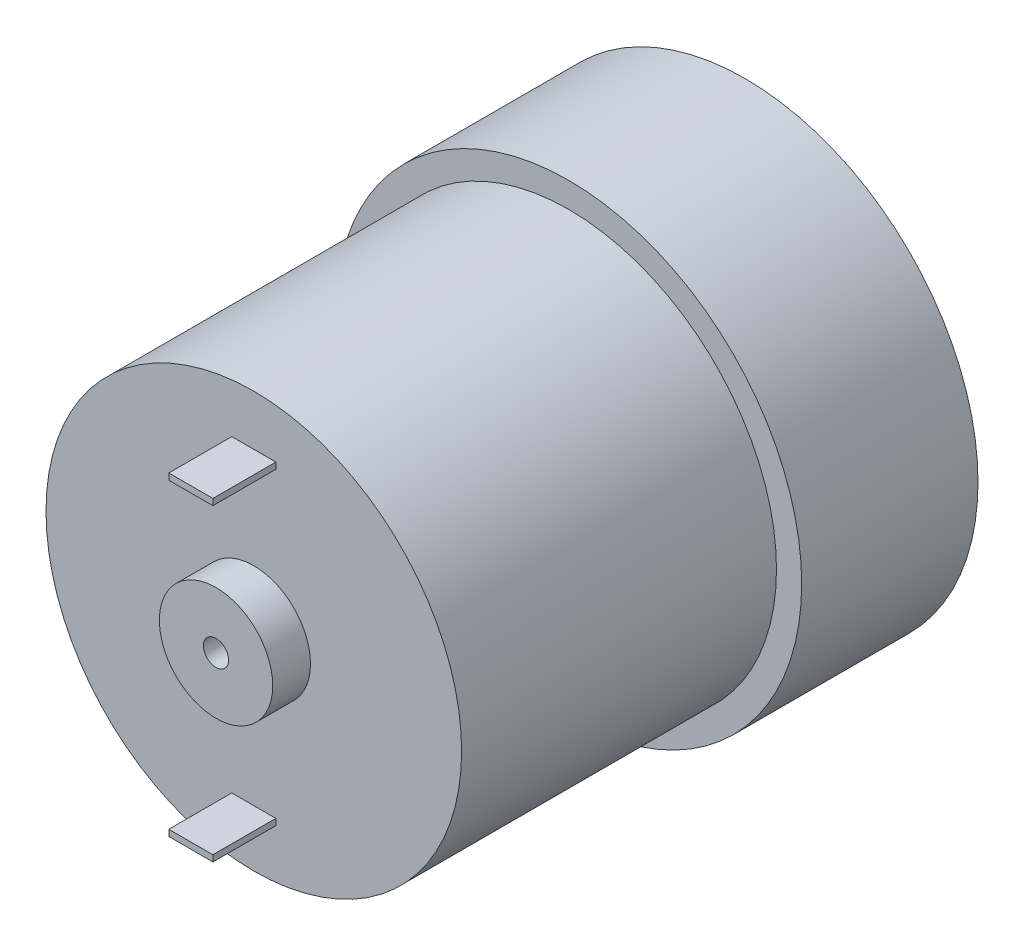
ISO-10303-21;
HEADER;
FILE_DESCRIPTION(('STEP AP214'),'2;1');
FILE_NAME('part.step','',(''),(''),'','','');
FILE_SCHEMA(('AUTOMOTIVE_DESIGN { 1 0 10303 214 1 1 1 1 }'));
ENDSEC;
DATA;
#1=APPLICATION_CONTEXT('core data for automotive mechanical design processes');
#2=APPLICATION_PROTOCOL_DEFINITION('international standard','automotive_design',2000,#1);
#3=PRODUCT_CONTEXT('',#1,'mechanical');
#4=PRODUCT('Part','Part','',(#3));
#5=PRODUCT_RELATED_PRODUCT_CATEGORY('part','',(#4));
#6=PRODUCT_DEFINITION_FORMATION('','',#4);
#7=PRODUCT_DEFINITION_CONTEXT('part definition',#1,'design');
#8=PRODUCT_DEFINITION('design','',#6,#7);
#9=PRODUCT_DEFINITION_SHAPE('','',#8);
#10=(LENGTH_UNIT() NAMED_UNIT(*) SI_UNIT(.MILLI.,.METRE.));
#11=(NAMED_UNIT(*) PLANE_ANGLE_UNIT() SI_UNIT($,.RADIAN.));
#12=(NAMED_UNIT(*) SI_UNIT($,.STERADIAN.) SOLID_ANGLE_UNIT());
#13=UNCERTAINTY_MEASURE_WITH_UNIT(LENGTH_MEASURE(1.E-05),#10,'distance_accuracy_value','');
#14=(GEOMETRIC_REPRESENTATION_CONTEXT(3) GLOBAL_UNCERTAINTY_ASSIGNED_CONTEXT((#13)) GLOBAL_UNIT_ASSIGNED_CONTEXT((#10,
#11,#12)) REPRESENTATION_CONTEXT('',''));
#15=CARTESIAN_POINT('',(0.,0.,0.));
#16=DIRECTION('',(0.,0.,1.));
#17=DIRECTION('',(1.,0.,0.));
#18=AXIS2_PLACEMENT_3D('',#15,#16,#17);
#19=CARTESIAN_POINT('',(0.,0.,39.));
#20=DIRECTION('',(0.,0.,1.));
#21=DIRECTION('',(1.,0.,0.));
#22=AXIS2_PLACEMENT_3D('',#19,#20,#21);
#23=PLANE('',#22);
#24=CARTESIAN_POINT('',(0.,0.,39.));
#25=DIRECTION('',(0.,0.,1.));
#26=DIRECTION('',(1.,0.,0.));
#27=AXIS2_PLACEMENT_3D('',#24,#25,#26);
#28=CIRCLE('',#27,4.5);
#29=CARTESIAN_POINT('',(4.5,0.,39.));
#30=VERTEX_POINT('',#29);
#31=EDGE_CURVE('E247',#30,#30,#28,.T.);
#32=ORIENTED_EDGE('',*,*,#31,.F.);
#33=EDGE_LOOP('',(#32));
#34=FACE_BOUND('',#33,.T.);
#35=CARTESIAN_POINT('',(0.,0.,39.));
#36=DIRECTION('',(0.,0.,1.));
#37=DIRECTION('',(1.,0.,0.));
#38=AXIS2_PLACEMENT_3D('',#35,#36,#37);
#39=CIRCLE('',#38,16.5);
#40=CARTESIAN_POINT('',(16.5,0.,39.));
#41=VERTEX_POINT('',#40);
#42=EDGE_CURVE('E235',#41,#41,#39,.T.);
#43=ORIENTED_EDGE('',*,*,#42,.T.);
#44=EDGE_LOOP('',(#43));
#45=FACE_BOUND('',#44,.T.);
#46=DIRECTION('',(1.,0.,0.));
#47=VECTOR('',#46,1.);
#48=CARTESIAN_POINT('',(1.74999999999997,12.,39.));
#49=LINE('',#48,#47);
#50=CARTESIAN_POINT('',(-1.75000000000003,12.,39.));
#51=VERTEX_POINT('',#50);
#52=CARTESIAN_POINT('',(1.74999999999997,12.,39.));
#53=VERTEX_POINT('',#52);
#54=EDGE_CURVE('E212',#51,#53,#49,.T.);
#55=ORIENTED_EDGE('',*,*,#54,.F.);
#56=DIRECTION('',(0.,-1.,0.));
#57=VECTOR('',#56,1.);
#58=CARTESIAN_POINT('',(-1.75000000000003,12.,39.));
#59=LINE('',#58,#57);
#60=CARTESIAN_POINT('',(-1.75,12.5,39.));
#61=VERTEX_POINT('',#60);
#62=EDGE_CURVE('E198',#61,#51,#59,.T.);
#63=ORIENTED_EDGE('',*,*,#62,.F.);
#64=DIRECTION('',(-1.,0.,0.));
#65=VECTOR('',#64,1.);
#66=CARTESIAN_POINT('',(1.75,12.5,39.));
#67=LINE('',#66,#65);
#68=CARTESIAN_POINT('',(1.75,12.5,39.));
#69=VERTEX_POINT('',#68);
#70=EDGE_CURVE('E203',#69,#61,#67,.T.);
#71=ORIENTED_EDGE('',*,*,#70,.F.);
#72=DIRECTION('',(0.,1.,0.));
#73=VECTOR('',#72,1.);
#74=CARTESIAN_POINT('',(1.74999999999997,12.,39.));
#75=LINE('',#74,#73);
#76=EDGE_CURVE('E214',#53,#69,#75,.T.);
#77=ORIENTED_EDGE('',*,*,#76,.F.);
#78=EDGE_LOOP('',(#55,#63,#71,#77));
#79=FACE_BOUND('',#78,.T.);
#80=DIRECTION('',(-1.,0.,0.));
#81=VECTOR('',#80,1.);
#82=CARTESIAN_POINT('',(-1.74999999999999,-12.,39.));
#83=LINE('',#82,#81);
#84=CARTESIAN_POINT('',(1.75000000000001,-12.,39.));
#85=VERTEX_POINT('',#84);
#86=CARTESIAN_POINT('',(-1.74999999999999,-12.,39.));
#87=VERTEX_POINT('',#86);
#88=EDGE_CURVE('E185',#85,#87,#83,.T.);
#89=ORIENTED_EDGE('',*,*,#88,.F.);
#90=DIRECTION('',(0.,1.,0.));
#91=VECTOR('',#90,1.);
#92=CARTESIAN_POINT('',(1.75000000000001,-12.,39.));
#93=LINE('',#92,#91);
#94=CARTESIAN_POINT('',(1.74999999999999,-12.5,39.));
#95=VERTEX_POINT('',#94);
#96=EDGE_CURVE('E171',#95,#85,#93,.T.);
#97=ORIENTED_EDGE('',*,*,#96,.F.);
#98=DIRECTION('',(1.,0.,0.));
#99=VECTOR('',#98,1.);
#100=CARTESIAN_POINT('',(-1.75000000000001,-12.5,39.));
#101=LINE('',#100,#99);
#102=CARTESIAN_POINT('',(-1.75000000000001,-12.5,39.));
#103=VERTEX_POINT('',#102);
#104=EDGE_CURVE('E176',#103,#95,#101,.T.);
#105=ORIENTED_EDGE('',*,*,#104,.F.);
#106=DIRECTION('',(0.,-1.,0.));
#107=VECTOR('',#106,1.);
#108=CARTESIAN_POINT('',(-1.74999999999999,-12.,39.));
#109=LINE('',#108,#107);
#110=EDGE_CURVE('E187',#87,#103,#109,.T.);
#111=ORIENTED_EDGE('',*,*,#110,.F.);
#112=EDGE_LOOP('',(#89,#97,#105,#111));
#113=FACE_BOUND('',#112,.T.);
#114=ADVANCED_FACE('F34',(#34,#45,#79,#113),#23,.T.);
#115=CARTESIAN_POINT('',(0.,0.,39.));
#116=DIRECTION('',(0.,0.,1.));
#117=DIRECTION('',(1.,0.,0.));
#118=AXIS2_PLACEMENT_3D('',#115,#116,#117);
#119=CYLINDRICAL_SURFACE('',#118,4.5);
#120=ORIENTED_EDGE('',*,*,#31,.T.);
#121=EDGE_LOOP('',(#120));
#122=FACE_BOUND('',#121,.T.);
#123=CARTESIAN_POINT('',(0.,0.,42.));
#124=DIRECTION('',(0.,0.,1.));
#125=DIRECTION('',(1.,0.,0.));
#126=AXIS2_PLACEMENT_3D('',#123,#124,#125);
#127=CIRCLE('',#126,4.5);
#128=CARTESIAN_POINT('',(4.5,0.,42.));
#129=VERTEX_POINT('',#128);
#130=EDGE_CURVE('E244',#129,#129,#127,.T.);
#131=ORIENTED_EDGE('',*,*,#130,.F.);
#132=EDGE_LOOP('',(#131));
#133=FACE_BOUND('',#132,.T.);
#134=ADVANCED_FACE('F277',(#122,#133),#119,.T.);
#135=CARTESIAN_POINT('',(0.,0.,42.));
#136=DIRECTION('',(0.,0.,1.));
#137=DIRECTION('',(1.,0.,0.));
#138=AXIS2_PLACEMENT_3D('',#135,#136,#137);
#139=PLANE('',#138);
#140=CARTESIAN_POINT('',(0.,0.,42.));
#141=DIRECTION('',(0.,0.,1.));
#142=DIRECTION('',(1.,0.,0.));
#143=AXIS2_PLACEMENT_3D('',#140,#141,#142);
#144=CIRCLE('',#143,1.);
#145=CARTESIAN_POINT('',(1.,0.,42.));
#146=VERTEX_POINT('',#145);
#147=EDGE_CURVE('E225',#146,#146,#144,.T.);
#148=ORIENTED_EDGE('',*,*,#147,.F.);
#149=EDGE_LOOP('',(#148));
#150=FACE_BOUND('',#149,.T.);
#151=ORIENTED_EDGE('',*,*,#130,.T.);
#152=EDGE_LOOP('',(#151));
#153=FACE_BOUND('',#152,.T.);
#154=ADVANCED_FACE('F283',(#150,#153),#139,.T.);
#155=CARTESIAN_POINT('',(0.,0.,14.));
#156=DIRECTION('',(0.,0.,1.));
#157=DIRECTION('',(1.,0.,0.));
#158=AXIS2_PLACEMENT_3D('',#155,#156,#157);
#159=CYLINDRICAL_SURFACE('',#158,16.5);
#160=CARTESIAN_POINT('',(0.,0.,14.));
#161=DIRECTION('',(0.,0.,1.));
#162=DIRECTION('',(1.,0.,0.));
#163=AXIS2_PLACEMENT_3D('',#160,#161,#162);
#164=CIRCLE('',#163,16.5);
#165=CARTESIAN_POINT('',(16.5,0.,14.));
#166=VERTEX_POINT('',#165);
#167=EDGE_CURVE('E238',#166,#166,#164,.T.);
#168=ORIENTED_EDGE('',*,*,#167,.T.);
#169=EDGE_LOOP('',(#168));
#170=FACE_BOUND('',#169,.T.);
#171=ORIENTED_EDGE('',*,*,#42,.F.);
#172=EDGE_LOOP('',(#171));
#173=FACE_BOUND('',#172,.T.);
#174=ADVANCED_FACE('F292',(#170,#173),#159,.T.);
#175=CARTESIAN_POINT('',(0.,0.,14.));
#176=DIRECTION('',(0.,0.,1.));
#177=DIRECTION('',(1.,0.,0.));
#178=AXIS2_PLACEMENT_3D('',#175,#176,#177);
#179=PLANE('',#178);
#180=ORIENTED_EDGE('',*,*,#167,.F.);
#181=EDGE_LOOP('',(#180));
#182=FACE_BOUND('',#181,.T.);
#183=CARTESIAN_POINT('',(0.,0.,14.));
#184=DIRECTION('',(0.,0.,1.));
#185=DIRECTION('',(1.,0.,0.));
#186=AXIS2_PLACEMENT_3D('',#183,#184,#185);
#187=CIRCLE('',#186,18.5);
#188=CARTESIAN_POINT('',(-18.5,0.,14.));
#189=VERTEX_POINT('',#188);
#190=EDGE_CURVE('E241',#189,#189,#187,.T.);
#191=ORIENTED_EDGE('',*,*,#190,.T.);
#192=EDGE_LOOP('',(#191));
#193=FACE_BOUND('',#192,.T.);
#194=ADVANCED_FACE('F297',(#182,#193),#179,.T.);
#195=CARTESIAN_POINT('',(0.,0.,0.));
#196=DIRECTION('',(0.,0.,1.));
#197=DIRECTION('',(1.,0.,0.));
#198=AXIS2_PLACEMENT_3D('',#195,#196,#197);
#199=PLANE('',#198);
#200=CARTESIAN_POINT('',(0.,15.5,0.));
#201=DIRECTION('',(0.,0.,-1.));
#202=DIRECTION('',(-1.,0.,0.));
#203=AXIS2_PLACEMENT_3D('',#200,#201,#202);
#204=CIRCLE('',#203,1.5);
#205=CARTESIAN_POINT('',(-1.5,15.5,0.));
#206=VERTEX_POINT('',#205);
#207=EDGE_CURVE('E131',#206,#206,#204,.T.);
#208=ORIENTED_EDGE('',*,*,#207,.F.);
#209=EDGE_LOOP('',(#208));
#210=FACE_BOUND('',#209,.T.);
#211=CARTESIAN_POINT('',(13.8293166859393,-7.,0.));
#212=DIRECTION('',(0.,0.,-1.));
#213=DIRECTION('',(-1.,0.,0.));
#214=AXIS2_PLACEMENT_3D('',#211,#212,#213);
#215=CIRCLE('',#214,1.5);
#216=CARTESIAN_POINT('',(12.3293166859393,-7.,0.));
#217=VERTEX_POINT('',#216);
#218=EDGE_CURVE('E130',#217,#217,#215,.T.);
#219=ORIENTED_EDGE('',*,*,#218,.F.);
#220=EDGE_LOOP('',(#219));
#221=FACE_BOUND('',#220,.T.);
#222=CARTESIAN_POINT('',(-13.8293166859393,-7.,0.));
#223=DIRECTION('',(0.,0.,-1.));
#224=DIRECTION('',(-1.,0.,0.));
#225=AXIS2_PLACEMENT_3D('',#222,#223,#224);
#226=CIRCLE('',#225,1.5);
#227=CARTESIAN_POINT('',(-15.3293166859393,-7.,0.));
#228=VERTEX_POINT('',#227);
#229=EDGE_CURVE('E141',#228,#228,#226,.T.);
#230=ORIENTED_EDGE('',*,*,#229,.F.);
#231=EDGE_LOOP('',(#230));
#232=FACE_BOUND('',#231,.T.);
#233=CARTESIAN_POINT('',(-15.5,0.,0.));
#234=DIRECTION('',(0.,0.,-1.));
#235=DIRECTION('',(-1.,0.,0.));
#236=AXIS2_PLACEMENT_3D('',#233,#234,#235);
#237=CIRCLE('',#236,1.24999999999999);
#238=CARTESIAN_POINT('',(-16.75,0.,0.));
#239=VERTEX_POINT('',#238);
#240=EDGE_CURVE('E147',#239,#239,#237,.T.);
#241=ORIENTED_EDGE('',*,*,#240,.F.);
#242=EDGE_LOOP('',(#241));
#243=FACE_BOUND('',#242,.T.);
#244=CARTESIAN_POINT('',(7.75000000000006,13.4233937586588,0.));
#245=DIRECTION('',(0.,0.,-1.));
#246=DIRECTION('',(-1.,0.,0.));
#247=AXIS2_PLACEMENT_3D('',#244,#245,#246);
#248=CIRCLE('',#247,1.24999999999999);
#249=CARTESIAN_POINT('',(6.50000000000008,13.4233937586588,0.));
#250=VERTEX_POINT('',#249);
#251=EDGE_CURVE('E153',#250,#250,#248,.T.);
#252=ORIENTED_EDGE('',*,*,#251,.F.);
#253=EDGE_LOOP('',(#252));
#254=FACE_BOUND('',#253,.T.);
#255=CARTESIAN_POINT('',(7.75000000000006,-13.4233937586588,0.));
#256=DIRECTION('',(0.,0.,-1.));
#257=DIRECTION('',(-1.,0.,0.));
#258=AXIS2_PLACEMENT_3D('',#255,#256,#257);
#259=CIRCLE('',#258,1.24999999999999);
#260=CARTESIAN_POINT('',(6.50000000000007,-13.4233937586588,0.));
#261=VERTEX_POINT('',#260);
#262=EDGE_CURVE('E159',#261,#261,#259,.T.);
#263=ORIENTED_EDGE('',*,*,#262,.F.);
#264=EDGE_LOOP('',(#263));
#265=FACE_BOUND('',#264,.T.);
#266=CARTESIAN_POINT('',(15.5,0.,0.));
#267=DIRECTION('',(0.,0.,-1.));
#268=DIRECTION('',(-1.,0.,0.));
#269=AXIS2_PLACEMENT_3D('',#266,#267,#268);
#270=CIRCLE('',#269,1.24999999999999);
#271=CARTESIAN_POINT('',(14.25,0.,0.));
#272=VERTEX_POINT('',#271);
#273=EDGE_CURVE('E165',#272,#272,#270,.T.);
#274=ORIENTED_EDGE('',*,*,#273,.F.);
#275=EDGE_LOOP('',(#274));
#276=FACE_BOUND('',#275,.T.);
#277=CARTESIAN_POINT('',(0.,-7.,0.));
#278=DIRECTION('',(0.,0.,1.));
#279=DIRECTION('',(1.,0.,0.));
#280=AXIS2_PLACEMENT_3D('',#277,#278,#279);
#281=CIRCLE('',#280,6.);
#282=CARTESIAN_POINT('',(6.,-7.,0.));
#283=VERTEX_POINT('',#282);
#284=EDGE_CURVE('E255',#283,#283,#281,.F.);
#285=ORIENTED_EDGE('',*,*,#284,.F.);
#286=EDGE_LOOP('',(#285));
#287=FACE_BOUND('',#286,.T.);
#288=CARTESIAN_POINT('',(0.,0.,0.));
#289=DIRECTION('',(0.,0.,1.));
#290=DIRECTION('',(1.,0.,0.));
#291=AXIS2_PLACEMENT_3D('',#288,#289,#290);
#292=CIRCLE('',#291,18.5);
#293=CARTESIAN_POINT('',(-18.5,0.,0.));
#294=VERTEX_POINT('',#293);
#295=EDGE_CURVE('E250',#294,#294,#292,.T.);
#296=ORIENTED_EDGE('',*,*,#295,.F.);
#297=EDGE_LOOP('',(#296));
#298=FACE_BOUND('',#297,.T.);
#299=ADVANCED_FACE('F294',(#210,#221,#232,#243,#254,#265,#276,#287,#298),#199,.F.);
#300=CARTESIAN_POINT('',(0.,0.,42.));
#301=DIRECTION('',(0.,0.,-1.));
#302=DIRECTION('',(-1.,0.,0.));
#303=AXIS2_PLACEMENT_3D('',#300,#301,#302);
#304=CYLINDRICAL_SURFACE('',#303,18.5);
#305=CARTESIAN_POINT('',(-18.5,0.,0.));
#306=CARTESIAN_POINT('',(-18.5,0.,0.145833333333333));
#307=CARTESIAN_POINT('',(-18.5,0.,0.291666666666667));
#308=CARTESIAN_POINT('',(-18.5,0.,0.583333333333334));
#309=CARTESIAN_POINT('',(-18.5,0.,0.729166666666667));
#310=CARTESIAN_POINT('',(-18.5,0.,1.02083333333333));
#311=CARTESIAN_POINT('',(-18.5,0.,1.16666666666667));
#312=CARTESIAN_POINT('',(-18.5,0.,1.45833333333333));
#313=CARTESIAN_POINT('',(-18.5,0.,1.60416666666667));
#314=CARTESIAN_POINT('',(-18.5,0.,1.89583333333334));
#315=CARTESIAN_POINT('',(-18.5,0.,2.04166666666667));
#316=CARTESIAN_POINT('',(-18.5,0.,2.33333333333334));
#317=CARTESIAN_POINT('',(-18.5,0.,2.47916666666667));
#318=CARTESIAN_POINT('',(-18.5,0.,2.77083333333334));
#319=CARTESIAN_POINT('',(-18.5,0.,2.91666666666667));
#320=CARTESIAN_POINT('',(-18.5,0.,3.20833333333334));
#321=CARTESIAN_POINT('',(-18.5,0.,3.35416666666667));
#322=CARTESIAN_POINT('',(-18.5,0.,3.64583333333333));
#323=CARTESIAN_POINT('',(-18.5,0.,3.79166666666667));
#324=CARTESIAN_POINT('',(-18.5,0.,4.08333333333333));
#325=CARTESIAN_POINT('',(-18.5,0.,4.22916666666666));
#326=CARTESIAN_POINT('',(-18.5,0.,4.52083333333333));
#327=CARTESIAN_POINT('',(-18.5,0.,4.66666666666666));
#328=CARTESIAN_POINT('',(-18.5,0.,4.95833333333333));
#329=CARTESIAN_POINT('',(-18.5,0.,5.10416666666666));
#330=CARTESIAN_POINT('',(-18.5,0.,5.39583333333333));
#331=CARTESIAN_POINT('',(-18.5,0.,5.54166666666666));
#332=CARTESIAN_POINT('',(-18.5,0.,5.83333333333333));
#333=CARTESIAN_POINT('',(-18.5,0.,5.97916666666667));
#334=CARTESIAN_POINT('',(-18.5,0.,6.27083333333333));
#335=CARTESIAN_POINT('',(-18.5,0.,6.41666666666667));
#336=CARTESIAN_POINT('',(-18.5,0.,6.70833333333333));
#337=CARTESIAN_POINT('',(-18.5,0.,6.85416666666667));
#338=CARTESIAN_POINT('',(-18.5,0.,7.14583333333333));
#339=CARTESIAN_POINT('',(-18.5,0.,7.29166666666667));
#340=CARTESIAN_POINT('',(-18.5,0.,7.58333333333333));
#341=CARTESIAN_POINT('',(-18.5,0.,7.72916666666667));
#342=CARTESIAN_POINT('',(-18.5,0.,8.02083333333333));
#343=CARTESIAN_POINT('',(-18.5,0.,8.16666666666667));
#344=CARTESIAN_POINT('',(-18.5,0.,8.45833333333333));
#345=CARTESIAN_POINT('',(-18.5,0.,8.60416666666667));
#346=CARTESIAN_POINT('',(-18.5,0.,8.89583333333333));
#347=CARTESIAN_POINT('',(-18.5,0.,9.04166666666667));
#348=CARTESIAN_POINT('',(-18.5,0.,9.33333333333333));
#349=CARTESIAN_POINT('',(-18.5,0.,9.47916666666666));
#350=CARTESIAN_POINT('',(-18.5,0.,9.77083333333333));
#351=CARTESIAN_POINT('',(-18.5,0.,9.91666666666667));
#352=CARTESIAN_POINT('',(-18.5,0.,10.2083333333333));
#353=CARTESIAN_POINT('',(-18.5,0.,10.3541666666667));
#354=CARTESIAN_POINT('',(-18.5,0.,10.6458333333333));
#355=CARTESIAN_POINT('',(-18.5,0.,10.7916666666667));
#356=CARTESIAN_POINT('',(-18.5,0.,11.0833333333333));
#357=CARTESIAN_POINT('',(-18.5,0.,11.2291666666667));
#358=CARTESIAN_POINT('',(-18.5,0.,11.5208333333333));
#359=CARTESIAN_POINT('',(-18.5,0.,11.6666666666667));
#360=CARTESIAN_POINT('',(-18.5,0.,11.9583333333333));
#361=CARTESIAN_POINT('',(-18.5,0.,12.1041666666667));
#362=CARTESIAN_POINT('',(-18.5,0.,12.3958333333333));
#363=CARTESIAN_POINT('',(-18.5,0.,12.5416666666667));
#364=CARTESIAN_POINT('',(-18.5,0.,12.8333333333333));
#365=CARTESIAN_POINT('',(-18.5,0.,12.9791666666667));
#366=CARTESIAN_POINT('',(-18.5,0.,13.2708333333333));
#367=CARTESIAN_POINT('',(-18.5,0.,13.4166666666667));
#368=CARTESIAN_POINT('',(-18.5,0.,13.7083333333333));
#369=CARTESIAN_POINT('',(-18.5,0.,13.8541666666667));
#370=CARTESIAN_POINT('',(-18.5,0.,14.));
#371=B_SPLINE_CURVE_WITH_KNOTS('',3,(#305,#306,#307,#308,#309,#310,#311,#312,#313,#314,#315,
#316,#317,#318,#319,#320,#321,#322,#323,#324,#325,#326,#327,#328,#329,#330,#331,#332,#333,#334,
#335,#336,#337,#338,#339,#340,#341,#342,#343,#344,#345,#346,#347,#348,#349,#350,#351,#352,#353,
#354,#355,#356,#357,#358,#359,#360,#361,#362,#363,#364,#365,#366,#367,#368,#369,#370),
.UNSPECIFIED.,.F.,.F.,(4,2,2,2,2,2,2,2,2,2,2,2,2,2,2,2,2,2,2,2,2,2,2,2,2,2,2,2,2,2,2,2,4),(0.,
0.4375,0.875000000000001,1.3125,1.75,2.1875,2.625,3.0625,3.5,3.9375,4.375,4.8125,5.25,5.6875,
6.125,6.5625,7.,7.4375,7.875,8.3125,8.75,9.1875,9.62499999999999,10.0625,10.5,10.9375,11.375,
11.8125,12.25,12.6875,13.125,13.5625,14.),.UNSPECIFIED.);
#372=EDGE_CURVE('BSEAM296',#294,#189,#371,.T.);
#373=ORIENTED_EDGE('',*,*,#295,.T.);
#374=ORIENTED_EDGE('',*,*,#190,.F.);
#375=ORIENTED_EDGE('',*,*,#372,.T.);
#376=ORIENTED_EDGE('',*,*,#372,.F.);
#377=EDGE_LOOP('',(#373,#375,#374,#376));
#378=FACE_BOUND('',#377,.T.);
#379=ADVANCED_FACE('F296',(#378),#304,.T.);
#380=CARTESIAN_POINT('',(0.,-7.,-4.6));
#381=DIRECTION('',(0.,0.,1.));
#382=DIRECTION('',(1.,0.,0.));
#383=AXIS2_PLACEMENT_3D('',#380,#381,#382);
#384=CYLINDRICAL_SURFACE('',#383,6.);
#385=CARTESIAN_POINT('',(0.,-7.,-4.1));
#386=DIRECTION('',(0.,0.,-1.));
#387=DIRECTION('',(-1.,0.,0.));
#388=AXIS2_PLACEMENT_3D('',#385,#386,#387);
#389=CIRCLE('',#388,6.);
#390=CARTESIAN_POINT('',(-6.,-7.,-4.1));
#391=VERTEX_POINT('',#390);
#392=EDGE_CURVE('E11',#391,#391,#389,.F.);
#393=ORIENTED_EDGE('',*,*,#392,.T.);
#394=EDGE_LOOP('',(#393));
#395=FACE_BOUND('',#394,.T.);
#396=ORIENTED_EDGE('',*,*,#284,.T.);
#397=EDGE_LOOP('',(#396));
#398=FACE_BOUND('',#397,.T.);
#399=ADVANCED_FACE('F272',(#395,#398),#384,.T.);
#400=CARTESIAN_POINT('',(0.,-7.,-4.6));
#401=DIRECTION('',(0.,0.,-1.));
#402=DIRECTION('',(-1.,0.,0.));
#403=AXIS2_PLACEMENT_3D('',#400,#401,#402);
#404=PLANE('',#403);
#405=CARTESIAN_POINT('',(0.,-7.,-4.6));
#406=DIRECTION('',(0.,0.,-1.));
#407=DIRECTION('',(-1.,0.,0.));
#408=AXIS2_PLACEMENT_3D('',#405,#406,#407);
#409=CIRCLE('',#408,3.);
#410=CARTESIAN_POINT('',(-3.,-7.,-4.6));
#411=VERTEX_POINT('',#410);
#412=EDGE_CURVE('E229',#411,#411,#409,.T.);
#413=ORIENTED_EDGE('',*,*,#412,.F.);
#414=EDGE_LOOP('',(#413));
#415=FACE_BOUND('',#414,.T.);
#416=CARTESIAN_POINT('',(0.,-7.,-4.6));
#417=DIRECTION('',(0.,0.,-1.));
#418=DIRECTION('',(-1.,0.,0.));
#419=AXIS2_PLACEMENT_3D('',#416,#417,#418);
#420=CIRCLE('',#419,5.5);
#421=CARTESIAN_POINT('',(-5.5,-7.,-4.6));
#422=VERTEX_POINT('',#421);
#423=EDGE_CURVE('E42',#422,#422,#420,.T.);
#424=ORIENTED_EDGE('',*,*,#423,.T.);
#425=EDGE_LOOP('',(#424));
#426=FACE_BOUND('',#425,.T.);
#427=ADVANCED_FACE('F260',(#415,#426),#404,.T.);
#428=CARTESIAN_POINT('',(0.,-7.,-4.1));
#429=DIRECTION('',(0.,0.,-1.));
#430=DIRECTION('',(-1.,0.,0.));
#431=AXIS2_PLACEMENT_3D('',#428,#429,#430);
#432=TOROIDAL_SURFACE('',#431,5.5,0.5);
#433=ORIENTED_EDGE('',*,*,#392,.F.);
#434=EDGE_LOOP('',(#433));
#435=FACE_BOUND('',#434,.T.);
#436=ORIENTED_EDGE('',*,*,#423,.F.);
#437=EDGE_LOOP('',(#436));
#438=FACE_BOUND('',#437,.T.);
#439=ADVANCED_FACE('F36',(#435,#438),#432,.T.);
#440=CARTESIAN_POINT('',(0.,-7.,5.4));
#441=DIRECTION('',(0.,0.,-1.));
#442=DIRECTION('',(-1.,0.,0.));
#443=AXIS2_PLACEMENT_3D('',#440,#441,#442);
#444=CYLINDRICAL_SURFACE('',#443,3.);
#445=CARTESIAN_POINT('',(0.,-7.,5.4));
#446=DIRECTION('',(0.,0.,-1.));
#447=DIRECTION('',(-1.,0.,0.));
#448=AXIS2_PLACEMENT_3D('',#445,#446,#447);
#449=CIRCLE('',#448,3.);
#450=CARTESIAN_POINT('',(-3.,-7.,5.4));
#451=VERTEX_POINT('',#450);
#452=EDGE_CURVE('E232',#451,#451,#449,.T.);
#453=ORIENTED_EDGE('',*,*,#452,.F.);
#454=EDGE_LOOP('',(#453));
#455=FACE_BOUND('',#454,.T.);
#456=ORIENTED_EDGE('',*,*,#412,.T.);
#457=EDGE_LOOP('',(#456));
#458=FACE_BOUND('',#457,.T.);
#459=ADVANCED_FACE('F263',(#455,#458),#444,.F.);
#460=CARTESIAN_POINT('',(0.,-7.,5.4));
#461=DIRECTION('',(0.,0.,-1.));
#462=DIRECTION('',(-1.,0.,0.));
#463=AXIS2_PLACEMENT_3D('',#460,#461,#462);
#464=PLANE('',#463);
#465=ORIENTED_EDGE('',*,*,#452,.T.);
#466=EDGE_LOOP('',(#465));
#467=FACE_BOUND('',#466,.T.);
#468=ADVANCED_FACE('F269',(#467),#464,.T.);
#469=CARTESIAN_POINT('',(0.,0.,32.));
#470=DIRECTION('',(0.,0.,1.));
#471=DIRECTION('',(1.,0.,0.));
#472=AXIS2_PLACEMENT_3D('',#469,#470,#471);
#473=CYLINDRICAL_SURFACE('',#472,1.);
#474=CARTESIAN_POINT('',(0.,0.,32.));
#475=DIRECTION('',(0.,0.,1.));
#476=DIRECTION('',(1.,0.,0.));
#477=AXIS2_PLACEMENT_3D('',#474,#475,#476);
#478=CIRCLE('',#477,1.);
#479=CARTESIAN_POINT('',(1.,0.,32.));
#480=VERTEX_POINT('',#479);
#481=EDGE_CURVE('E226',#480,#480,#478,.T.);
#482=ORIENTED_EDGE('',*,*,#481,.F.);
#483=EDGE_LOOP('',(#482));
#484=FACE_BOUND('',#483,.T.);
#485=ORIENTED_EDGE('',*,*,#147,.T.);
#486=EDGE_LOOP('',(#485));
#487=FACE_BOUND('',#486,.T.);
#488=ADVANCED_FACE('F321',(#484,#487),#473,.F.);
#489=CARTESIAN_POINT('',(0.,0.,32.));
#490=DIRECTION('',(0.,0.,1.));
#491=DIRECTION('',(1.,0.,0.));
#492=AXIS2_PLACEMENT_3D('',#489,#490,#491);
#493=PLANE('',#492);
#494=ORIENTED_EDGE('',*,*,#481,.T.);
#495=EDGE_LOOP('',(#494));
#496=FACE_BOUND('',#495,.T.);
#497=ADVANCED_FACE('F325',(#496),#493,.T.);
#498=CARTESIAN_POINT('',(-1.75000000000003,12.,44.));
#499=DIRECTION('',(1.,0.,0.));
#500=DIRECTION('',(0.,1.,0.));
#501=AXIS2_PLACEMENT_3D('',#498,#499,#500);
#502=PLANE('',#501);
#503=ORIENTED_EDGE('',*,*,#62,.T.);
#504=DIRECTION('',(0.,0.,-1.));
#505=VECTOR('',#504,1.);
#506=CARTESIAN_POINT('',(-1.75000000000003,12.,44.));
#507=LINE('',#506,#505);
#508=CARTESIAN_POINT('',(-1.75000000000003,12.,44.));
#509=VERTEX_POINT('',#508);
#510=EDGE_CURVE('E223',#509,#51,#507,.T.);
#511=ORIENTED_EDGE('',*,*,#510,.F.);
#512=DIRECTION('',(0.,-1.,0.));
#513=VECTOR('',#512,1.);
#514=CARTESIAN_POINT('',(-1.75000000000003,12.,44.));
#515=LINE('',#514,#513);
#516=CARTESIAN_POINT('',(-1.75,12.5,44.));
#517=VERTEX_POINT('',#516);
#518=EDGE_CURVE('E199',#517,#509,#515,.T.);
#519=ORIENTED_EDGE('',*,*,#518,.F.);
#520=DIRECTION('',(0.,0.,-1.));
#521=VECTOR('',#520,1.);
#522=CARTESIAN_POINT('',(-1.75,12.5,44.));
#523=LINE('',#522,#521);
#524=EDGE_CURVE('E209',#517,#61,#523,.T.);
#525=ORIENTED_EDGE('',*,*,#524,.T.);
#526=EDGE_LOOP('',(#503,#511,#519,#525));
#527=FACE_BOUND('',#526,.T.);
#528=ADVANCED_FACE('F329',(#527),#502,.F.);
#529=CARTESIAN_POINT('',(1.74999999999997,12.,44.));
#530=DIRECTION('',(0.,1.,0.));
#531=DIRECTION('',(0.,0.,1.));
#532=AXIS2_PLACEMENT_3D('',#529,#530,#531);
#533=PLANE('',#532);
#534=ORIENTED_EDGE('',*,*,#54,.T.);
#535=DIRECTION('',(0.,0.,-1.));
#536=VECTOR('',#535,1.);
#537=CARTESIAN_POINT('',(1.74999999999997,12.,44.));
#538=LINE('',#537,#536);
#539=CARTESIAN_POINT('',(1.74999999999997,12.,44.));
#540=VERTEX_POINT('',#539);
#541=EDGE_CURVE('E220',#540,#53,#538,.T.);
#542=ORIENTED_EDGE('',*,*,#541,.F.);
#543=DIRECTION('',(1.,0.,0.));
#544=VECTOR('',#543,1.);
#545=CARTESIAN_POINT('',(1.74999999999997,12.,44.));
#546=LINE('',#545,#544);
#547=EDGE_CURVE('E202',#509,#540,#546,.T.);
#548=ORIENTED_EDGE('',*,*,#547,.F.);
#549=ORIENTED_EDGE('',*,*,#510,.T.);
#550=EDGE_LOOP('',(#534,#542,#548,#549));
#551=FACE_BOUND('',#550,.T.);
#552=ADVANCED_FACE('F333',(#551),#533,.F.);
#553=CARTESIAN_POINT('',(1.74999999999997,12.,44.));
#554=DIRECTION('',(-1.,0.,0.));
#555=DIRECTION('',(0.,-1.,0.));
#556=AXIS2_PLACEMENT_3D('',#553,#554,#555);
#557=PLANE('',#556);
#558=ORIENTED_EDGE('',*,*,#76,.T.);
#559=DIRECTION('',(0.,0.,-1.));
#560=VECTOR('',#559,1.);
#561=CARTESIAN_POINT('',(1.75,12.5,44.));
#562=LINE('',#561,#560);
#563=CARTESIAN_POINT('',(1.75,12.5,44.));
#564=VERTEX_POINT('',#563);
#565=EDGE_CURVE('E57',#564,#69,#562,.T.);
#566=ORIENTED_EDGE('',*,*,#565,.F.);
#567=DIRECTION('',(0.,1.,0.));
#568=VECTOR('',#567,1.);
#569=CARTESIAN_POINT('',(1.74999999999997,12.,44.));
#570=LINE('',#569,#568);
#571=EDGE_CURVE('E205',#540,#564,#570,.T.);
#572=ORIENTED_EDGE('',*,*,#571,.F.);
#573=ORIENTED_EDGE('',*,*,#541,.T.);
#574=EDGE_LOOP('',(#558,#566,#572,#573));
#575=FACE_BOUND('',#574,.T.);
#576=ADVANCED_FACE('F337',(#575),#557,.F.);
#577=CARTESIAN_POINT('',(1.75,12.5,44.));
#578=DIRECTION('',(0.,-1.,0.));
#579=DIRECTION('',(0.,0.,-1.));
#580=AXIS2_PLACEMENT_3D('',#577,#578,#579);
#581=PLANE('',#580);
#582=ORIENTED_EDGE('',*,*,#70,.T.);
#583=ORIENTED_EDGE('',*,*,#524,.F.);
#584=DIRECTION('',(-1.,0.,0.));
#585=VECTOR('',#584,1.);
#586=CARTESIAN_POINT('',(1.75,12.5,44.));
#587=LINE('',#586,#585);
#588=EDGE_CURVE('E207',#564,#517,#587,.T.);
#589=ORIENTED_EDGE('',*,*,#588,.F.);
#590=ORIENTED_EDGE('',*,*,#565,.T.);
#591=EDGE_LOOP('',(#582,#583,#589,#590));
#592=FACE_BOUND('',#591,.T.);
#593=ADVANCED_FACE('F341',(#592),#581,.F.);
#594=CARTESIAN_POINT('',(0.,0.,44.));
#595=DIRECTION('',(0.,0.,1.));
#596=DIRECTION('',(1.,0.,0.));
#597=AXIS2_PLACEMENT_3D('',#594,#595,#596);
#598=PLANE('',#597);
#599=ORIENTED_EDGE('',*,*,#518,.T.);
#600=ORIENTED_EDGE('',*,*,#547,.T.);
#601=ORIENTED_EDGE('',*,*,#571,.T.);
#602=ORIENTED_EDGE('',*,*,#588,.T.);
#603=EDGE_LOOP('',(#599,#600,#601,#602));
#604=FACE_BOUND('',#603,.T.);
#605=ADVANCED_FACE('F345',(#604),#598,.T.);
#606=CARTESIAN_POINT('',(1.75000000000001,-12.,44.));
#607=DIRECTION('',(-1.,0.,0.));
#608=DIRECTION('',(0.,-1.,0.));
#609=AXIS2_PLACEMENT_3D('',#606,#607,#608);
#610=PLANE('',#609);
#611=ORIENTED_EDGE('',*,*,#96,.T.);
#612=DIRECTION('',(0.,0.,-1.));
#613=VECTOR('',#612,1.);
#614=CARTESIAN_POINT('',(1.75000000000001,-12.,44.));
#615=LINE('',#614,#613);
#616=CARTESIAN_POINT('',(1.75000000000001,-12.,44.));
#617=VERTEX_POINT('',#616);
#618=EDGE_CURVE('E196',#617,#85,#615,.T.);
#619=ORIENTED_EDGE('',*,*,#618,.F.);
#620=DIRECTION('',(0.,1.,0.));
#621=VECTOR('',#620,1.);
#622=CARTESIAN_POINT('',(1.75000000000001,-12.,44.));
#623=LINE('',#622,#621);
#624=CARTESIAN_POINT('',(1.74999999999999,-12.5,44.));
#625=VERTEX_POINT('',#624);
#626=EDGE_CURVE('E172',#625,#617,#623,.T.);
#627=ORIENTED_EDGE('',*,*,#626,.F.);
#628=DIRECTION('',(0.,0.,-1.));
#629=VECTOR('',#628,1.);
#630=CARTESIAN_POINT('',(1.74999999999999,-12.5,44.));
#631=LINE('',#630,#629);
#632=EDGE_CURVE('E182',#625,#95,#631,.T.);
#633=ORIENTED_EDGE('',*,*,#632,.T.);
#634=EDGE_LOOP('',(#611,#619,#627,#633));
#635=FACE_BOUND('',#634,.T.);
#636=ADVANCED_FACE('F348',(#635),#610,.F.);
#637=CARTESIAN_POINT('',(-1.74999999999999,-12.,44.));
#638=DIRECTION('',(0.,-1.,0.));
#639=DIRECTION('',(0.,0.,-1.));
#640=AXIS2_PLACEMENT_3D('',#637,#638,#639);
#641=PLANE('',#640);
#642=ORIENTED_EDGE('',*,*,#88,.T.);
#643=DIRECTION('',(0.,0.,-1.));
#644=VECTOR('',#643,1.);
#645=CARTESIAN_POINT('',(-1.74999999999999,-12.,44.));
#646=LINE('',#645,#644);
#647=CARTESIAN_POINT('',(-1.74999999999999,-12.,44.));
#648=VERTEX_POINT('',#647);
#649=EDGE_CURVE('E193',#648,#87,#646,.T.);
#650=ORIENTED_EDGE('',*,*,#649,.F.);
#651=DIRECTION('',(-1.,0.,0.));
#652=VECTOR('',#651,1.);
#653=CARTESIAN_POINT('',(-1.74999999999999,-12.,44.));
#654=LINE('',#653,#652);
#655=EDGE_CURVE('E175',#617,#648,#654,.T.);
#656=ORIENTED_EDGE('',*,*,#655,.F.);
#657=ORIENTED_EDGE('',*,*,#618,.T.);
#658=EDGE_LOOP('',(#642,#650,#656,#657));
#659=FACE_BOUND('',#658,.T.);
#660=ADVANCED_FACE('F352',(#659),#641,.F.);
#661=CARTESIAN_POINT('',(-1.74999999999999,-12.,44.));
#662=DIRECTION('',(1.,0.,0.));
#663=DIRECTION('',(0.,1.,0.));
#664=AXIS2_PLACEMENT_3D('',#661,#662,#663);
#665=PLANE('',#664);
#666=ORIENTED_EDGE('',*,*,#110,.T.);
#667=DIRECTION('',(0.,0.,-1.));
#668=VECTOR('',#667,1.);
#669=CARTESIAN_POINT('',(-1.75000000000001,-12.5,44.));
#670=LINE('',#669,#668);
#671=CARTESIAN_POINT('',(-1.75000000000001,-12.5,44.));
#672=VERTEX_POINT('',#671);
#673=EDGE_CURVE('E49',#672,#103,#670,.T.);
#674=ORIENTED_EDGE('',*,*,#673,.F.);
#675=DIRECTION('',(0.,-1.,0.));
#676=VECTOR('',#675,1.);
#677=CARTESIAN_POINT('',(-1.74999999999999,-12.,44.));
#678=LINE('',#677,#676);
#679=EDGE_CURVE('E178',#648,#672,#678,.T.);
#680=ORIENTED_EDGE('',*,*,#679,.F.);
#681=ORIENTED_EDGE('',*,*,#649,.T.);
#682=EDGE_LOOP('',(#666,#674,#680,#681));
#683=FACE_BOUND('',#682,.T.);
#684=ADVANCED_FACE('F356',(#683),#665,.F.);
#685=CARTESIAN_POINT('',(-1.75000000000001,-12.5,44.));
#686=DIRECTION('',(0.,1.,0.));
#687=DIRECTION('',(0.,0.,1.));
#688=AXIS2_PLACEMENT_3D('',#685,#686,#687);
#689=PLANE('',#688);
#690=ORIENTED_EDGE('',*,*,#104,.T.);
#691=ORIENTED_EDGE('',*,*,#632,.F.);
#692=DIRECTION('',(1.,0.,0.));
#693=VECTOR('',#692,1.);
#694=CARTESIAN_POINT('',(-1.75000000000001,-12.5,44.));
#695=LINE('',#694,#693);
#696=EDGE_CURVE('E180',#672,#625,#695,.T.);
#697=ORIENTED_EDGE('',*,*,#696,.F.);
#698=ORIENTED_EDGE('',*,*,#673,.T.);
#699=EDGE_LOOP('',(#690,#691,#697,#698));
#700=FACE_BOUND('',#699,.T.);
#701=ADVANCED_FACE('F360',(#700),#689,.F.);
#702=CARTESIAN_POINT('',(0.,0.,44.));
#703=DIRECTION('',(0.,0.,1.));
#704=DIRECTION('',(1.,0.,0.));
#705=AXIS2_PLACEMENT_3D('',#702,#703,#704);
#706=PLANE('',#705);
#707=ORIENTED_EDGE('',*,*,#626,.T.);
#708=ORIENTED_EDGE('',*,*,#655,.T.);
#709=ORIENTED_EDGE('',*,*,#679,.T.);
#710=ORIENTED_EDGE('',*,*,#696,.T.);
#711=EDGE_LOOP('',(#707,#708,#709,#710));
#712=FACE_BOUND('',#711,.T.);
#713=ADVANCED_FACE('F364',(#712),#706,.T.);
#714=CARTESIAN_POINT('',(15.5,0.,7.50000000000001));
#715=DIRECTION('',(0.,0.,-1.));
#716=DIRECTION('',(-1.,0.,0.));
#717=AXIS2_PLACEMENT_3D('',#714,#715,#716);
#718=CONICAL_SURFACE('',#717,1.24999999999999,1.02974425867665);
#719=CARTESIAN_POINT('',(15.5,0.,8.25107577378445));
#720=VERTEX_POINT('',#719);
#721=VERTEX_LOOP('',#720);
#722=FACE_BOUND('',#721,.T.);
#723=CARTESIAN_POINT('',(15.5,0.,7.50000000000001));
#724=DIRECTION('',(0.,0.,-1.));
#725=DIRECTION('',(-1.,0.,0.));
#726=AXIS2_PLACEMENT_3D('',#723,#724,#725);
#727=CIRCLE('',#726,1.24999999999999);
#728=CARTESIAN_POINT('',(14.25,0.,7.50000000000001));
#729=VERTEX_POINT('',#728);
#730=EDGE_CURVE('E168',#729,#729,#727,.T.);
#731=ORIENTED_EDGE('',*,*,#730,.T.);
#732=EDGE_LOOP('',(#731));
#733=FACE_BOUND('',#732,.T.);
#734=ADVANCED_FACE('F367',(#722,#733),#718,.F.);
#735=CARTESIAN_POINT('',(15.5,0.,0.));
#736=DIRECTION('',(0.,0.,-1.));
#737=DIRECTION('',(-1.,0.,0.));
#738=AXIS2_PLACEMENT_3D('',#735,#736,#737);
#739=CYLINDRICAL_SURFACE('',#738,1.24999999999999);
#740=ORIENTED_EDGE('',*,*,#730,.F.);
#741=EDGE_LOOP('',(#740));
#742=FACE_BOUND('',#741,.T.);
#743=ORIENTED_EDGE('',*,*,#273,.T.);
#744=EDGE_LOOP('',(#743));
#745=FACE_BOUND('',#744,.T.);
#746=ADVANCED_FACE('F371',(#742,#745),#739,.F.);
#747=CARTESIAN_POINT('',(7.75000000000006,-13.4233937586588,7.50000000000001));
#748=DIRECTION('',(0.,0.,-1.));
#749=DIRECTION('',(-1.,0.,0.));
#750=AXIS2_PLACEMENT_3D('',#747,#748,#749);
#751=CONICAL_SURFACE('',#750,1.24999999999999,1.02974425867665);
#752=CARTESIAN_POINT('',(7.75000000000006,-13.4233937586588,8.25107577378445));
#753=VERTEX_POINT('',#752);
#754=VERTEX_LOOP('',#753);
#755=FACE_BOUND('',#754,.T.);
#756=CARTESIAN_POINT('',(7.75000000000006,-13.4233937586588,7.50000000000001));
#757=DIRECTION('',(0.,0.,-1.));
#758=DIRECTION('',(-1.,0.,0.));
#759=AXIS2_PLACEMENT_3D('',#756,#757,#758);
#760=CIRCLE('',#759,1.24999999999999);
#761=CARTESIAN_POINT('',(6.50000000000008,-13.4233937586588,7.50000000000001));
#762=VERTEX_POINT('',#761);
#763=EDGE_CURVE('E162',#762,#762,#760,.T.);
#764=ORIENTED_EDGE('',*,*,#763,.T.);
#765=EDGE_LOOP('',(#764));
#766=FACE_BOUND('',#765,.T.);
#767=ADVANCED_FACE('F375',(#755,#766),#751,.F.);
#768=CARTESIAN_POINT('',(7.75000000000006,-13.4233937586588,0.));
#769=DIRECTION('',(0.,0.,-1.));
#770=DIRECTION('',(-1.,0.,0.));
#771=AXIS2_PLACEMENT_3D('',#768,#769,#770);
#772=CYLINDRICAL_SURFACE('',#771,1.24999999999999);
#773=ORIENTED_EDGE('',*,*,#763,.F.);
#774=EDGE_LOOP('',(#773));
#775=FACE_BOUND('',#774,.T.);
#776=ORIENTED_EDGE('',*,*,#262,.T.);
#777=EDGE_LOOP('',(#776));
#778=FACE_BOUND('',#777,.T.);
#779=ADVANCED_FACE('F379',(#775,#778),#772,.F.);
#780=CARTESIAN_POINT('',(7.75000000000006,13.4233937586588,7.50000000000001));
#781=DIRECTION('',(0.,0.,-1.));
#782=DIRECTION('',(-1.,0.,0.));
#783=AXIS2_PLACEMENT_3D('',#780,#781,#782);
#784=CONICAL_SURFACE('',#783,1.24999999999999,1.02974425867665);
#785=CARTESIAN_POINT('',(7.75000000000006,13.4233937586588,8.25107577378445));
#786=VERTEX_POINT('',#785);
#787=VERTEX_LOOP('',#786);
#788=FACE_BOUND('',#787,.T.);
#789=CARTESIAN_POINT('',(7.75000000000006,13.4233937586588,7.50000000000001));
#790=DIRECTION('',(0.,0.,-1.));
#791=DIRECTION('',(-1.,0.,0.));
#792=AXIS2_PLACEMENT_3D('',#789,#790,#791);
#793=CIRCLE('',#792,1.24999999999999);
#794=CARTESIAN_POINT('',(6.50000000000008,13.4233937586588,7.50000000000001));
#795=VERTEX_POINT('',#794);
#796=EDGE_CURVE('E156',#795,#795,#793,.T.);
#797=ORIENTED_EDGE('',*,*,#796,.T.);
#798=EDGE_LOOP('',(#797));
#799=FACE_BOUND('',#798,.T.);
#800=ADVANCED_FACE('F383',(#788,#799),#784,.F.);
#801=CARTESIAN_POINT('',(7.75000000000006,13.4233937586588,0.));
#802=DIRECTION('',(0.,0.,-1.));
#803=DIRECTION('',(-1.,0.,0.));
#804=AXIS2_PLACEMENT_3D('',#801,#802,#803);
#805=CYLINDRICAL_SURFACE('',#804,1.24999999999999);
#806=ORIENTED_EDGE('',*,*,#796,.F.);
#807=EDGE_LOOP('',(#806));
#808=FACE_BOUND('',#807,.T.);
#809=ORIENTED_EDGE('',*,*,#251,.T.);
#810=EDGE_LOOP('',(#809));
#811=FACE_BOUND('',#810,.T.);
#812=ADVANCED_FACE('F387',(#808,#811),#805,.F.);
#813=CARTESIAN_POINT('',(-15.5,0.,7.50000000000001));
#814=DIRECTION('',(0.,0.,-1.));
#815=DIRECTION('',(-1.,0.,0.));
#816=AXIS2_PLACEMENT_3D('',#813,#814,#815);
#817=CONICAL_SURFACE('',#816,1.24999999999999,1.02974425867665);
#818=CARTESIAN_POINT('',(-15.5,0.,8.25107577378445));
#819=VERTEX_POINT('',#818);
#820=VERTEX_LOOP('',#819);
#821=FACE_BOUND('',#820,.T.);
#822=CARTESIAN_POINT('',(-15.5,0.,7.50000000000001));
#823=DIRECTION('',(0.,0.,-1.));
#824=DIRECTION('',(-1.,0.,0.));
#825=AXIS2_PLACEMENT_3D('',#822,#823,#824);
#826=CIRCLE('',#825,1.24999999999999);
#827=CARTESIAN_POINT('',(-16.75,0.,7.50000000000001));
#828=VERTEX_POINT('',#827);
#829=EDGE_CURVE('E150',#828,#828,#826,.T.);
#830=ORIENTED_EDGE('',*,*,#829,.T.);
#831=EDGE_LOOP('',(#830));
#832=FACE_BOUND('',#831,.T.);
#833=ADVANCED_FACE('F391',(#821,#832),#817,.F.);
#834=CARTESIAN_POINT('',(-15.5,0.,0.));
#835=DIRECTION('',(0.,0.,-1.));
#836=DIRECTION('',(-1.,0.,0.));
#837=AXIS2_PLACEMENT_3D('',#834,#835,#836);
#838=CYLINDRICAL_SURFACE('',#837,1.24999999999999);
#839=ORIENTED_EDGE('',*,*,#829,.F.);
#840=EDGE_LOOP('',(#839));
#841=FACE_BOUND('',#840,.T.);
#842=ORIENTED_EDGE('',*,*,#240,.T.);
#843=EDGE_LOOP('',(#842));
#844=FACE_BOUND('',#843,.T.);
#845=ADVANCED_FACE('F395',(#841,#844),#838,.F.);
#846=CARTESIAN_POINT('',(-13.8293166859393,-7.,7.5));
#847=DIRECTION('',(0.,0.,-1.));
#848=DIRECTION('',(-1.,0.,0.));
#849=AXIS2_PLACEMENT_3D('',#846,#847,#848);
#850=CONICAL_SURFACE('',#849,1.5,1.02974425867665);
#851=CARTESIAN_POINT('',(-13.8293166859393,-7.,8.40129092854134));
#852=VERTEX_POINT('',#851);
#853=VERTEX_LOOP('',#852);
#854=FACE_BOUND('',#853,.T.);
#855=CARTESIAN_POINT('',(-13.8293166859393,-7.,7.5));
#856=DIRECTION('',(0.,0.,-1.));
#857=DIRECTION('',(-1.,0.,0.));
#858=AXIS2_PLACEMENT_3D('',#855,#856,#857);
#859=CIRCLE('',#858,1.5);
#860=CARTESIAN_POINT('',(-15.3293166859393,-7.,7.5));
#861=VERTEX_POINT('',#860);
#862=EDGE_CURVE('E144',#861,#861,#859,.T.);
#863=ORIENTED_EDGE('',*,*,#862,.T.);
#864=EDGE_LOOP('',(#863));
#865=FACE_BOUND('',#864,.T.);
#866=ADVANCED_FACE('F399',(#854,#865),#850,.F.);
#867=CARTESIAN_POINT('',(-13.8293166859393,-7.,0.));
#868=DIRECTION('',(0.,0.,-1.));
#869=DIRECTION('',(-1.,0.,0.));
#870=AXIS2_PLACEMENT_3D('',#867,#868,#869);
#871=CYLINDRICAL_SURFACE('',#870,1.5);
#872=ORIENTED_EDGE('',*,*,#862,.F.);
#873=EDGE_LOOP('',(#872));
#874=FACE_BOUND('',#873,.T.);
#875=ORIENTED_EDGE('',*,*,#229,.T.);
#876=EDGE_LOOP('',(#875));
#877=FACE_BOUND('',#876,.T.);
#878=ADVANCED_FACE('F403',(#874,#877),#871,.F.);
#879=CARTESIAN_POINT('',(13.8293166859393,-7.,7.5));
#880=DIRECTION('',(0.,0.,-1.));
#881=DIRECTION('',(-1.,0.,0.));
#882=AXIS2_PLACEMENT_3D('',#879,#880,#881);
#883=CONICAL_SURFACE('',#882,1.5,1.02974425867665);
#884=CARTESIAN_POINT('',(13.8293166859393,-7.,8.40129092854134));
#885=VERTEX_POINT('',#884);
#886=VERTEX_LOOP('',#885);
#887=FACE_BOUND('',#886,.T.);
#888=CARTESIAN_POINT('',(13.8293166859393,-7.,7.5));
#889=DIRECTION('',(0.,0.,-1.));
#890=DIRECTION('',(-1.,0.,0.));
#891=AXIS2_PLACEMENT_3D('',#888,#889,#890);
#892=CIRCLE('',#891,1.5);
#893=CARTESIAN_POINT('',(12.3293166859393,-7.,7.5));
#894=VERTEX_POINT('',#893);
#895=EDGE_CURVE('E134',#894,#894,#892,.T.);
#896=ORIENTED_EDGE('',*,*,#895,.T.);
#897=EDGE_LOOP('',(#896));
#898=FACE_BOUND('',#897,.T.);
#899=ADVANCED_FACE('F407',(#887,#898),#883,.F.);
#900=CARTESIAN_POINT('',(13.8293166859393,-7.,0.));
#901=DIRECTION('',(0.,0.,-1.));
#902=DIRECTION('',(-1.,0.,0.));
#903=AXIS2_PLACEMENT_3D('',#900,#901,#902);
#904=CYLINDRICAL_SURFACE('',#903,1.5);
#905=ORIENTED_EDGE('',*,*,#895,.F.);
#906=EDGE_LOOP('',(#905));
#907=FACE_BOUND('',#906,.T.);
#908=ORIENTED_EDGE('',*,*,#218,.T.);
#909=EDGE_LOOP('',(#908));
#910=FACE_BOUND('',#909,.T.);
#911=ADVANCED_FACE('F124',(#907,#910),#904,.F.);
#912=CARTESIAN_POINT('',(0.,15.5,7.5));
#913=DIRECTION('',(0.,0.,-1.));
#914=DIRECTION('',(-1.,0.,0.));
#915=AXIS2_PLACEMENT_3D('',#912,#913,#914);
#916=CONICAL_SURFACE('',#915,1.5,1.02974425867665);
#917=CARTESIAN_POINT('',(0.,15.5,8.40129092854134));
#918=VERTEX_POINT('',#917);
#919=VERTEX_LOOP('',#918);
#920=FACE_BOUND('',#919,.T.);
#921=CARTESIAN_POINT('',(0.,15.5,7.5));
#922=DIRECTION('',(0.,0.,-1.));
#923=DIRECTION('',(-1.,0.,0.));
#924=AXIS2_PLACEMENT_3D('',#921,#922,#923);
#925=CIRCLE('',#924,1.5);
#926=CARTESIAN_POINT('',(-1.5,15.5,7.5));
#927=VERTEX_POINT('',#926);
#928=EDGE_CURVE('E128',#927,#927,#925,.T.);
#929=ORIENTED_EDGE('',*,*,#928,.T.);
#930=EDGE_LOOP('',(#929));
#931=FACE_BOUND('',#930,.T.);
#932=ADVANCED_FACE('F120',(#920,#931),#916,.F.);
#933=CARTESIAN_POINT('',(0.,15.5,0.));
#934=DIRECTION('',(0.,0.,-1.));
#935=DIRECTION('',(-1.,0.,0.));
#936=AXIS2_PLACEMENT_3D('',#933,#934,#935);
#937=CYLINDRICAL_SURFACE('',#936,1.5);
#938=ORIENTED_EDGE('',*,*,#928,.F.);
#939=EDGE_LOOP('',(#938));
#940=FACE_BOUND('',#939,.T.);
#941=ORIENTED_EDGE('',*,*,#207,.T.);
#942=EDGE_LOOP('',(#941));
#943=FACE_BOUND('',#942,.T.);
#944=ADVANCED_FACE('F123',(#940,#943),#937,.F.);
#945=CLOSED_SHELL('',(#114,#134,#154,#174,#194,#299,#379,#399,#427,#439,#459,#468,#488,#497,
#528,#552,#576,#593,#605,#636,#660,#684,#701,#713,#734,#746,#767,#779,#800,#812,#833,#845,#866,
#878,#899,#911,#932,#944));
#946=MANIFOLD_SOLID_BREP('B2',#945);
#947=ADVANCED_BREP_SHAPE_REPRESENTATION('',(#18,#946),#14);
#948=SHAPE_DEFINITION_REPRESENTATION(#9,#947);
ENDSEC;
END-ISO-10303-21;
